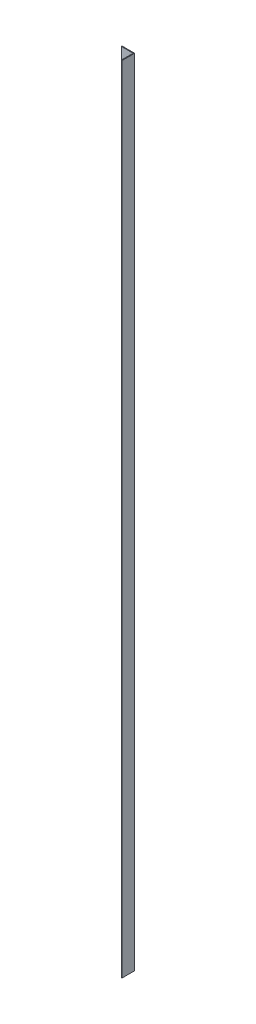
ISO-10303-21;
HEADER;
FILE_DESCRIPTION(('STEP AP214'),'2;1');
FILE_NAME('part.step','',(''),(''),'','','');
FILE_SCHEMA(('AUTOMOTIVE_DESIGN { 1 0 10303 214 1 1 1 1 }'));
ENDSEC;
DATA;
#1=APPLICATION_CONTEXT('core data for automotive mechanical design processes');
#2=APPLICATION_PROTOCOL_DEFINITION('international standard','automotive_design',2000,#1);
#3=PRODUCT_CONTEXT('',#1,'mechanical');
#4=PRODUCT('Part','Part','',(#3));
#5=PRODUCT_RELATED_PRODUCT_CATEGORY('part','',(#4));
#6=PRODUCT_DEFINITION_FORMATION('','',#4);
#7=PRODUCT_DEFINITION_CONTEXT('part definition',#1,'design');
#8=PRODUCT_DEFINITION('design','',#6,#7);
#9=PRODUCT_DEFINITION_SHAPE('','',#8);
#10=(LENGTH_UNIT() NAMED_UNIT(*) SI_UNIT(.MILLI.,.METRE.));
#11=(NAMED_UNIT(*) PLANE_ANGLE_UNIT() SI_UNIT($,.RADIAN.));
#12=(NAMED_UNIT(*) SI_UNIT($,.STERADIAN.) SOLID_ANGLE_UNIT());
#13=UNCERTAINTY_MEASURE_WITH_UNIT(LENGTH_MEASURE(1.E-05),#10,'distance_accuracy_value','');
#14=(GEOMETRIC_REPRESENTATION_CONTEXT(3) GLOBAL_UNCERTAINTY_ASSIGNED_CONTEXT((#13)) GLOBAL_UNIT_ASSIGNED_CONTEXT((#10,
#11,#12)) REPRESENTATION_CONTEXT('',''));
#15=CARTESIAN_POINT('',(0.,0.,0.));
#16=DIRECTION('',(0.,0.,1.));
#17=DIRECTION('',(1.,0.,0.));
#18=AXIS2_PLACEMENT_3D('',#15,#16,#17);
#19=CARTESIAN_POINT('',(275.000000000003,75.,169.500000000001));
#20=DIRECTION('',(1.00000000000001,0.,0.));
#21=DIRECTION('',(0.,0.,-1.00000000000001));
#22=AXIS2_PLACEMENT_3D('',#19,#20,#21);
#23=PLANE('',#22);
#24=DIRECTION('',(0.,0.,1.00000000000001));
#25=VECTOR('',#24,1.);
#26=CARTESIAN_POINT('',(275.000000000003,-1575.,169.500000000001));
#27=LINE('',#26,#25);
#28=CARTESIAN_POINT('',(275.000000000003,-1575.,143.500000000001));
#29=VERTEX_POINT('',#28);
#30=CARTESIAN_POINT('',(275.000000000003,-1575.,169.500000000001));
#31=VERTEX_POINT('',#30);
#32=EDGE_CURVE('E115',#29,#31,#27,.T.);
#33=ORIENTED_EDGE('',*,*,#32,.F.);
#34=DIRECTION('',(0.,-1.,0.));
#35=VECTOR('',#34,1.);
#36=CARTESIAN_POINT('',(275.000000000003,75.,143.500000000001));
#37=LINE('',#36,#35);
#38=CARTESIAN_POINT('',(275.000000000003,75.,143.500000000001));
#39=VERTEX_POINT('',#38);
#40=EDGE_CURVE('E11',#39,#29,#37,.T.);
#41=ORIENTED_EDGE('',*,*,#40,.F.);
#42=DIRECTION('',(0.,0.,1.00000000000001));
#43=VECTOR('',#42,1.);
#44=CARTESIAN_POINT('',(275.000000000003,75.,169.500000000001));
#45=LINE('',#44,#43);
#46=CARTESIAN_POINT('',(275.000000000003,75.,169.500000000001));
#47=VERTEX_POINT('',#46);
#48=EDGE_CURVE('E129',#39,#47,#45,.T.);
#49=ORIENTED_EDGE('',*,*,#48,.T.);
#50=DIRECTION('',(0.,-1.,0.));
#51=VECTOR('',#50,1.);
#52=CARTESIAN_POINT('',(275.000000000003,75.,169.500000000001));
#53=LINE('',#52,#51);
#54=EDGE_CURVE('E33',#47,#31,#53,.T.);
#55=ORIENTED_EDGE('',*,*,#54,.T.);
#56=EDGE_LOOP('',(#33,#41,#49,#55));
#57=FACE_BOUND('',#56,.T.);
#58=ADVANCED_FACE('F30',(#57),#23,.T.);
#59=CARTESIAN_POINT('',(275.000000000003,75.,143.500000000001));
#60=DIRECTION('',(0.,0.,-1.00000000000001));
#61=DIRECTION('',(-1.00000000000001,0.,0.));
#62=AXIS2_PLACEMENT_3D('',#59,#60,#61);
#63=PLANE('',#62);
#64=DIRECTION('',(1.00000000000001,0.,0.));
#65=VECTOR('',#64,1.);
#66=CARTESIAN_POINT('',(275.000000000003,-1575.,143.500000000001));
#67=LINE('',#66,#65);
#68=CARTESIAN_POINT('',(249.000000000002,-1575.,143.500000000001));
#69=VERTEX_POINT('',#68);
#70=EDGE_CURVE('E127',#69,#29,#67,.T.);
#71=ORIENTED_EDGE('',*,*,#70,.F.);
#72=DIRECTION('',(0.,-1.,0.));
#73=VECTOR('',#72,1.);
#74=CARTESIAN_POINT('',(249.000000000002,75.,143.500000000001));
#75=LINE('',#74,#73);
#76=CARTESIAN_POINT('',(249.000000000002,75.,143.500000000001));
#77=VERTEX_POINT('',#76);
#78=EDGE_CURVE('E39',#77,#69,#75,.T.);
#79=ORIENTED_EDGE('',*,*,#78,.F.);
#80=DIRECTION('',(1.00000000000001,0.,0.));
#81=VECTOR('',#80,1.);
#82=CARTESIAN_POINT('',(275.000000000003,75.,143.500000000001));
#83=LINE('',#82,#81);
#84=EDGE_CURVE('E105',#77,#39,#83,.T.);
#85=ORIENTED_EDGE('',*,*,#84,.T.);
#86=ORIENTED_EDGE('',*,*,#40,.T.);
#87=EDGE_LOOP('',(#71,#79,#85,#86));
#88=FACE_BOUND('',#87,.T.);
#89=ADVANCED_FACE('F137',(#88),#63,.T.);
#90=CARTESIAN_POINT('',(249.000000000002,75.,145.000000000001));
#91=DIRECTION('',(-1.00000000000001,0.,0.));
#92=DIRECTION('',(0.,0.,1.00000000000001));
#93=AXIS2_PLACEMENT_3D('',#90,#91,#92);
#94=PLANE('',#93);
#95=DIRECTION('',(0.,0.,-1.00000000000001));
#96=VECTOR('',#95,1.);
#97=CARTESIAN_POINT('',(249.000000000002,-1575.,145.000000000001));
#98=LINE('',#97,#96);
#99=CARTESIAN_POINT('',(249.000000000002,-1575.,145.000000000001));
#100=VERTEX_POINT('',#99);
#101=EDGE_CURVE('E92',#100,#69,#98,.T.);
#102=ORIENTED_EDGE('',*,*,#101,.F.);
#103=DIRECTION('',(0.,-1.,0.));
#104=VECTOR('',#103,1.);
#105=CARTESIAN_POINT('',(249.000000000002,75.,145.000000000001));
#106=LINE('',#105,#104);
#107=CARTESIAN_POINT('',(249.000000000002,75.,145.000000000001));
#108=VERTEX_POINT('',#107);
#109=EDGE_CURVE('E87',#108,#100,#106,.T.);
#110=ORIENTED_EDGE('',*,*,#109,.F.);
#111=DIRECTION('',(0.,0.,-1.00000000000001));
#112=VECTOR('',#111,1.);
#113=CARTESIAN_POINT('',(249.000000000002,75.,145.000000000001));
#114=LINE('',#113,#112);
#115=EDGE_CURVE('E90',#108,#77,#114,.T.);
#116=ORIENTED_EDGE('',*,*,#115,.T.);
#117=ORIENTED_EDGE('',*,*,#78,.T.);
#118=EDGE_LOOP('',(#102,#110,#116,#117));
#119=FACE_BOUND('',#118,.T.);
#120=ADVANCED_FACE('F89',(#119),#94,.T.);
#121=CARTESIAN_POINT('',(249.000000000002,75.,145.000000000001));
#122=DIRECTION('',(0.,0.,1.00000000000001));
#123=DIRECTION('',(1.00000000000001,0.,0.));
#124=AXIS2_PLACEMENT_3D('',#121,#122,#123);
#125=PLANE('',#124);
#126=DIRECTION('',(-1.00000000000001,0.,0.));
#127=VECTOR('',#126,1.);
#128=CARTESIAN_POINT('',(249.000000000002,-1575.,145.000000000001));
#129=LINE('',#128,#127);
#130=CARTESIAN_POINT('',(273.500000000003,-1575.,145.000000000001));
#131=VERTEX_POINT('',#130);
#132=EDGE_CURVE('E124',#131,#100,#129,.T.);
#133=ORIENTED_EDGE('',*,*,#132,.F.);
#134=DIRECTION('',(0.,-1.,0.));
#135=VECTOR('',#134,1.);
#136=CARTESIAN_POINT('',(273.500000000003,75.,145.000000000001));
#137=LINE('',#136,#135);
#138=CARTESIAN_POINT('',(273.500000000003,75.,145.000000000001));
#139=VERTEX_POINT('',#138);
#140=EDGE_CURVE('E97',#139,#131,#137,.T.);
#141=ORIENTED_EDGE('',*,*,#140,.F.);
#142=DIRECTION('',(-1.00000000000001,0.,0.));
#143=VECTOR('',#142,1.);
#144=CARTESIAN_POINT('',(249.000000000002,75.,145.000000000001));
#145=LINE('',#144,#143);
#146=EDGE_CURVE('E103',#139,#108,#145,.T.);
#147=ORIENTED_EDGE('',*,*,#146,.T.);
#148=ORIENTED_EDGE('',*,*,#109,.T.);
#149=EDGE_LOOP('',(#133,#141,#147,#148));
#150=FACE_BOUND('',#149,.T.);
#151=ADVANCED_FACE('F107',(#150),#125,.T.);
#152=CARTESIAN_POINT('',(273.500000000003,75.,145.000000000001));
#153=DIRECTION('',(-1.00000000000001,0.,0.));
#154=DIRECTION('',(0.,0.,1.00000000000001));
#155=AXIS2_PLACEMENT_3D('',#152,#153,#154);
#156=PLANE('',#155);
#157=DIRECTION('',(0.,0.,-1.00000000000001));
#158=VECTOR('',#157,1.);
#159=CARTESIAN_POINT('',(273.500000000003,-1575.,145.000000000001));
#160=LINE('',#159,#158);
#161=CARTESIAN_POINT('',(273.500000000003,-1575.,169.500000000001));
#162=VERTEX_POINT('',#161);
#163=EDGE_CURVE('E121',#162,#131,#160,.T.);
#164=ORIENTED_EDGE('',*,*,#163,.F.);
#165=DIRECTION('',(0.,-1.,0.));
#166=VECTOR('',#165,1.);
#167=CARTESIAN_POINT('',(273.500000000003,75.,169.500000000001));
#168=LINE('',#167,#166);
#169=CARTESIAN_POINT('',(273.500000000003,75.,169.500000000001));
#170=VERTEX_POINT('',#169);
#171=EDGE_CURVE('E132',#170,#162,#168,.T.);
#172=ORIENTED_EDGE('',*,*,#171,.F.);
#173=DIRECTION('',(0.,0.,-1.00000000000001));
#174=VECTOR('',#173,1.);
#175=CARTESIAN_POINT('',(273.500000000003,75.,145.000000000001));
#176=LINE('',#175,#174);
#177=EDGE_CURVE('E108',#170,#139,#176,.T.);
#178=ORIENTED_EDGE('',*,*,#177,.T.);
#179=ORIENTED_EDGE('',*,*,#140,.T.);
#180=EDGE_LOOP('',(#164,#172,#178,#179));
#181=FACE_BOUND('',#180,.T.);
#182=ADVANCED_FACE('F150',(#181),#156,.T.);
#183=CARTESIAN_POINT('',(275.000000000003,75.,169.500000000001));
#184=DIRECTION('',(0.,0.,1.00000000000001));
#185=DIRECTION('',(1.00000000000001,0.,0.));
#186=AXIS2_PLACEMENT_3D('',#183,#184,#185);
#187=PLANE('',#186);
#188=DIRECTION('',(-1.00000000000001,0.,0.));
#189=VECTOR('',#188,1.);
#190=CARTESIAN_POINT('',(275.000000000003,-1575.,169.500000000001));
#191=LINE('',#190,#189);
#192=EDGE_CURVE('E118',#31,#162,#191,.T.);
#193=ORIENTED_EDGE('',*,*,#192,.F.);
#194=ORIENTED_EDGE('',*,*,#54,.F.);
#195=DIRECTION('',(-1.00000000000001,0.,0.));
#196=VECTOR('',#195,1.);
#197=CARTESIAN_POINT('',(275.000000000003,75.,169.500000000001));
#198=LINE('',#197,#196);
#199=EDGE_CURVE('E110',#47,#170,#198,.T.);
#200=ORIENTED_EDGE('',*,*,#199,.T.);
#201=ORIENTED_EDGE('',*,*,#171,.T.);
#202=EDGE_LOOP('',(#193,#194,#200,#201));
#203=FACE_BOUND('',#202,.T.);
#204=ADVANCED_FACE('F134',(#203),#187,.T.);
#205=CARTESIAN_POINT('',(0.,75.,0.));
#206=DIRECTION('',(0.,1.,0.));
#207=DIRECTION('',(0.,0.,1.00000000000001));
#208=AXIS2_PLACEMENT_3D('',#205,#206,#207);
#209=PLANE('',#208);
#210=ORIENTED_EDGE('',*,*,#48,.F.);
#211=ORIENTED_EDGE('',*,*,#84,.F.);
#212=ORIENTED_EDGE('',*,*,#115,.F.);
#213=ORIENTED_EDGE('',*,*,#146,.F.);
#214=ORIENTED_EDGE('',*,*,#177,.F.);
#215=ORIENTED_EDGE('',*,*,#199,.F.);
#216=EDGE_LOOP('',(#210,#211,#212,#213,#214,#215));
#217=FACE_BOUND('',#216,.T.);
#218=ADVANCED_FACE('F101',(#217),#209,.T.);
#219=CARTESIAN_POINT('',(0.,-1575.,-8.88178419700125E-13));
#220=DIRECTION('',(0.,1.,0.));
#221=DIRECTION('',(0.,0.,1.00000000000001));
#222=AXIS2_PLACEMENT_3D('',#219,#220,#221);
#223=PLANE('',#222);
#224=ORIENTED_EDGE('',*,*,#32,.T.);
#225=ORIENTED_EDGE('',*,*,#192,.T.);
#226=ORIENTED_EDGE('',*,*,#163,.T.);
#227=ORIENTED_EDGE('',*,*,#132,.T.);
#228=ORIENTED_EDGE('',*,*,#101,.T.);
#229=ORIENTED_EDGE('',*,*,#70,.T.);
#230=EDGE_LOOP('',(#224,#225,#226,#227,#228,#229));
#231=FACE_BOUND('',#230,.T.);
#232=ADVANCED_FACE('F136',(#231),#223,.F.);
#233=CLOSED_SHELL('',(#58,#89,#120,#151,#182,#204,#218,#232));
#234=MANIFOLD_SOLID_BREP('B2',#233);
#235=ADVANCED_BREP_SHAPE_REPRESENTATION('',(#18,#234),#14);
#236=SHAPE_DEFINITION_REPRESENTATION(#9,#235);
ENDSEC;
END-ISO-10303-21;
